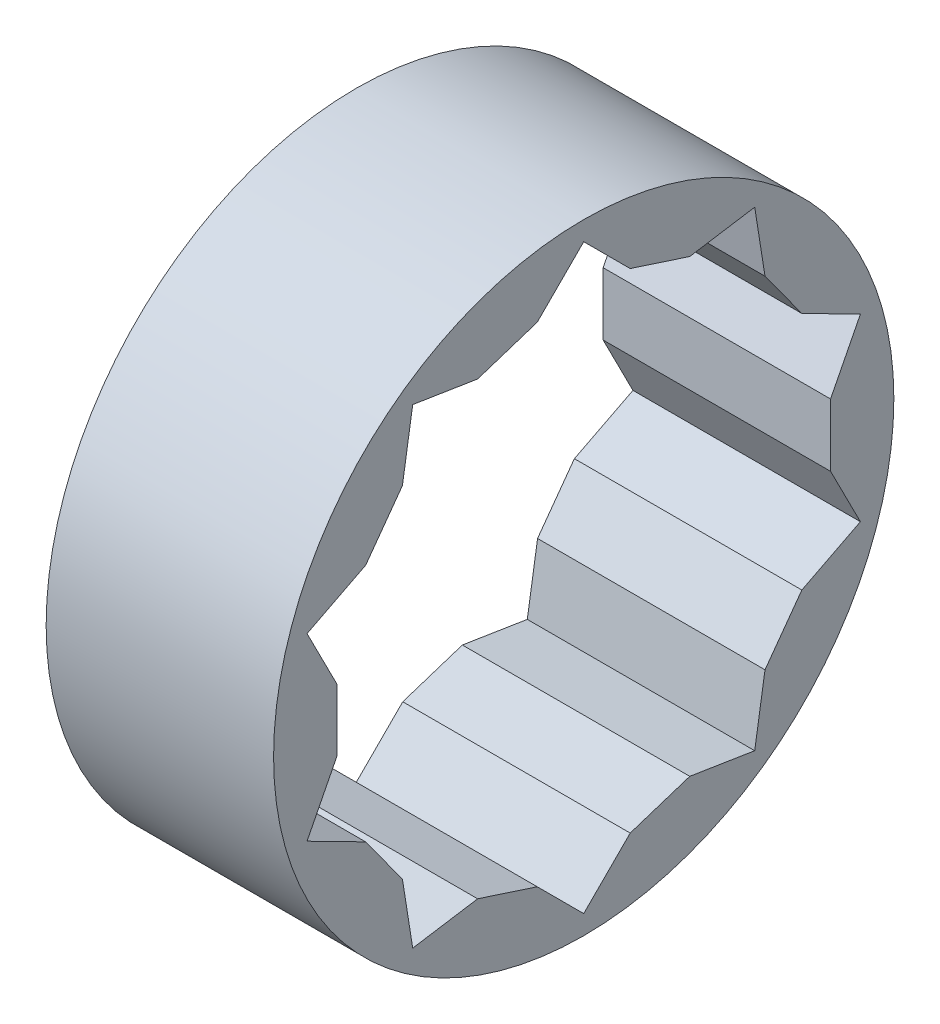
ISO-10303-21;
HEADER;
FILE_DESCRIPTION(('STEP AP214'),'2;1');
FILE_NAME('part.step','',(''),(''),'','','');
FILE_SCHEMA(('AUTOMOTIVE_DESIGN { 1 0 10303 214 1 1 1 1 }'));
ENDSEC;
DATA;
#1=APPLICATION_CONTEXT('core data for automotive mechanical design processes');
#2=APPLICATION_PROTOCOL_DEFINITION('international standard','automotive_design',2000,#1);
#3=PRODUCT_CONTEXT('',#1,'mechanical');
#4=PRODUCT('Part','Part','',(#3));
#5=PRODUCT_RELATED_PRODUCT_CATEGORY('part','',(#4));
#6=PRODUCT_DEFINITION_FORMATION('','',#4);
#7=PRODUCT_DEFINITION_CONTEXT('part definition',#1,'design');
#8=PRODUCT_DEFINITION('design','',#6,#7);
#9=PRODUCT_DEFINITION_SHAPE('','',#8);
#10=(LENGTH_UNIT() NAMED_UNIT(*) SI_UNIT(.MILLI.,.METRE.));
#11=(NAMED_UNIT(*) PLANE_ANGLE_UNIT() SI_UNIT($,.RADIAN.));
#12=(NAMED_UNIT(*) SI_UNIT($,.STERADIAN.) SOLID_ANGLE_UNIT());
#13=UNCERTAINTY_MEASURE_WITH_UNIT(LENGTH_MEASURE(1.E-05),#10,'distance_accuracy_value','');
#14=(GEOMETRIC_REPRESENTATION_CONTEXT(3) GLOBAL_UNCERTAINTY_ASSIGNED_CONTEXT((#13)) GLOBAL_UNIT_ASSIGNED_CONTEXT((#10,
#11,#12)) REPRESENTATION_CONTEXT('',''));
#15=CARTESIAN_POINT('',(0.,0.,0.));
#16=DIRECTION('',(0.,0.,1.));
#17=DIRECTION('',(1.,0.,0.));
#18=AXIS2_PLACEMENT_3D('',#15,#16,#17);
#19=CARTESIAN_POINT('',(22.,0.,0.));
#20=DIRECTION('',(1.,0.,0.));
#21=DIRECTION('',(0.,0.,-1.));
#22=AXIS2_PLACEMENT_3D('',#19,#20,#21);
#23=PLANE('',#22);
#24=CARTESIAN_POINT('',(22.,0.,0.));
#25=DIRECTION('',(1.,0.,0.));
#26=DIRECTION('',(0.,0.,-1.));
#27=AXIS2_PLACEMENT_3D('',#24,#25,#26);
#28=CIRCLE('',#27,30.);
#29=CARTESIAN_POINT('',(22.,0.,-30.));
#30=VERTEX_POINT('',#29);
#31=EDGE_CURVE('E11',#30,#30,#28,.T.);
#32=ORIENTED_EDGE('',*,*,#31,.T.);
#33=EDGE_LOOP('',(#32));
#34=FACE_BOUND('',#33,.T.);
#35=DIRECTION('',(0.,-0.809016994374925,0.587785252292504));
#36=VECTOR('',#35,1.);
#37=CARTESIAN_POINT('',(22.,11.5832247084016,21.0979328695125));
#38=LINE('',#37,#36);
#39=CARTESIAN_POINT('',(22.,16.4859132513626,17.5359211414864));
#40=VERTEX_POINT('',#39);
#41=CARTESIAN_POINT('',(22.,11.5832247084016,21.0979328695125));
#42=VERTEX_POINT('',#41);
#43=EDGE_CURVE('E249',#40,#42,#38,.T.);
#44=ORIENTED_EDGE('',*,*,#43,.F.);
#45=DIRECTION('',(0.,-0.987688340595256,0.156434465039482));
#46=VECTOR('',#45,1.);
#47=CARTESIAN_POINT('',(22.,16.4859132513626,17.5359211414864));
#48=LINE('',#47,#46);
#49=CARTESIAN_POINT('',(22.,22.7668881230699,16.5411124517435));
#50=VERTEX_POINT('',#49);
#51=EDGE_CURVE('E241',#50,#40,#48,.T.);
#52=ORIENTED_EDGE('',*,*,#51,.F.);
#53=DIRECTION('',(0.,0.156434465041359,0.987688340594959));
#54=VECTOR('',#53,1.);
#55=CARTESIAN_POINT('',(22.,22.7668881230699,16.5411124517435));
#56=LINE('',#55,#54);
#57=CARTESIAN_POINT('',(22.,21.7720794333149,10.2601375800374));
#58=VERTEX_POINT('',#57);
#59=EDGE_CURVE('E317',#58,#50,#56,.T.);
#60=ORIENTED_EDGE('',*,*,#59,.F.);
#61=DIRECTION('',(0.,-0.309016994374911,0.951056516295165));
#62=VECTOR('',#61,1.);
#63=CARTESIAN_POINT('',(22.,21.7720794333149,10.2601375800374));
#64=LINE('',#63,#62);
#65=CARTESIAN_POINT('',(22.,23.644739820471,4.49668153576589));
#66=VERTEX_POINT('',#65);
#67=EDGE_CURVE('E315',#66,#58,#64,.T.);
#68=ORIENTED_EDGE('',*,*,#67,.F.);
#69=DIRECTION('',(0.,-0.707106781186536,0.707106781186559));
#70=VECTOR('',#69,1.);
#71=CARTESIAN_POINT('',(22.,23.644739820471,4.49668153576589));
#72=LINE('',#71,#70);
#73=CARTESIAN_POINT('',(22.,28.1414213562373,-5.27369489224105E-13));
#74=VERTEX_POINT('',#73);
#75=EDGE_CURVE('E313',#74,#66,#72,.T.);
#76=ORIENTED_EDGE('',*,*,#75,.F.);
#77=DIRECTION('',(0.,0.707106781186562,0.707106781186533));
#78=VECTOR('',#77,1.);
#79=CARTESIAN_POINT('',(22.,28.1414213562373,-5.27369489224105E-13));
#80=LINE('',#79,#78);
#81=CARTESIAN_POINT('',(22.,23.6447398204709,-4.49668153576679));
#82=VERTEX_POINT('',#81);
#83=EDGE_CURVE('E311',#82,#74,#80,.T.);
#84=ORIENTED_EDGE('',*,*,#83,.F.);
#85=DIRECTION('',(0.,0.309016994375075,0.951056516295112));
#86=VECTOR('',#85,1.);
#87=CARTESIAN_POINT('',(22.,23.6447398204709,-4.49668153576679));
#88=LINE('',#87,#86);
#89=CARTESIAN_POINT('',(22.,21.7720794333138,-10.2601375800377));
#90=VERTEX_POINT('',#89);
#91=EDGE_CURVE('E309',#90,#82,#88,.T.);
#92=ORIENTED_EDGE('',*,*,#91,.F.);
#93=DIRECTION('',(0.,-0.156434465040067,0.987688340595164));
#94=VECTOR('',#93,1.);
#95=CARTESIAN_POINT('',(22.,21.7720794333138,-10.2601375800377));
#96=LINE('',#95,#94);
#97=CARTESIAN_POINT('',(22.,22.7668881230604,-16.5411124517443));
#98=VERTEX_POINT('',#97);
#99=EDGE_CURVE('E307',#98,#90,#96,.T.);
#100=ORIENTED_EDGE('',*,*,#99,.F.);
#101=DIRECTION('',(0.,0.987688340595167,0.156434465040044));
#102=VECTOR('',#101,1.);
#103=CARTESIAN_POINT('',(22.,22.7668881230604,-16.5411124517443));
#104=LINE('',#103,#102);
#105=CARTESIAN_POINT('',(22.,16.4859132513538,-17.5359211414908));
#106=VERTEX_POINT('',#105);
#107=EDGE_CURVE('E305',#106,#98,#104,.T.);
#108=ORIENTED_EDGE('',*,*,#107,.F.);
#109=DIRECTION('',(0.,0.809016994374948,0.587785252292473));
#110=VECTOR('',#109,1.);
#111=CARTESIAN_POINT('',(22.,16.4859132513538,-17.5359211414908));
#112=LINE('',#111,#110);
#113=CARTESIAN_POINT('',(22.,11.5832247083928,-21.0979328695166));
#114=VERTEX_POINT('',#113);
#115=EDGE_CURVE('E303',#114,#106,#112,.T.);
#116=ORIENTED_EDGE('',*,*,#115,.F.);
#117=DIRECTION('',(0.,0.45399049973967,0.891006524188305));
#118=VECTOR('',#117,1.);
#119=CARTESIAN_POINT('',(22.,11.5832247083928,-21.0979328695166));
#120=LINE('',#119,#118);
#121=CARTESIAN_POINT('',(22.,8.69617744494109,-26.7640821586548));
#122=VERTEX_POINT('',#121);
#123=EDGE_CURVE('E301',#122,#114,#120,.T.);
#124=ORIENTED_EDGE('',*,*,#123,.F.);
#125=DIRECTION('',(0.,0.891006524188297,-0.453990499739685));
#126=VECTOR('',#125,1.);
#127=CARTESIAN_POINT('',(22.,8.69617744494109,-26.7640821586548));
#128=LINE('',#127,#126);
#129=CARTESIAN_POINT('',(22.,3.03002815580295,-23.8770348952031));
#130=VERTEX_POINT('',#129);
#131=EDGE_CURVE('E299',#130,#122,#128,.T.);
#132=ORIENTED_EDGE('',*,*,#131,.F.);
#133=DIRECTION('',(0.,1.,0.));
#134=VECTOR('',#133,1.);
#135=CARTESIAN_POINT('',(22.,3.03002815580295,-23.8770348952031));
#136=LINE('',#135,#134);
#137=CARTESIAN_POINT('',(22.,-3.03002815580631,-23.8770348952031));
#138=VERTEX_POINT('',#137);
#139=EDGE_CURVE('E297',#138,#130,#136,.T.);
#140=ORIENTED_EDGE('',*,*,#139,.F.);
#141=DIRECTION('',(0.,0.891006524188205,0.453990499739867));
#142=VECTOR('',#141,1.);
#143=CARTESIAN_POINT('',(22.,-3.03002815580631,-23.8770348952031));
#144=LINE('',#143,#142);
#145=CARTESIAN_POINT('',(22.,-8.69617744494391,-26.764082158656));
#146=VERTEX_POINT('',#145);
#147=EDGE_CURVE('E295',#146,#138,#144,.T.);
#148=ORIENTED_EDGE('',*,*,#147,.F.);
#149=DIRECTION('',(0.,0.453990499739379,-0.891006524188453));
#150=VECTOR('',#149,1.);
#151=CARTESIAN_POINT('',(22.,-8.69617744494391,-26.764082158656));
#152=LINE('',#151,#150);
#153=CARTESIAN_POINT('',(22.,-11.5832247083938,-21.0979328695168));
#154=VERTEX_POINT('',#153);
#155=EDGE_CURVE('E293',#154,#146,#152,.T.);
#156=ORIENTED_EDGE('',*,*,#155,.F.);
#157=DIRECTION('',(0.,0.809016994374925,-0.587785252292505));
#158=VECTOR('',#157,1.);
#159=CARTESIAN_POINT('',(22.,-11.5832247083938,-21.0979328695168));
#160=LINE('',#159,#158);
#161=CARTESIAN_POINT('',(22.,-16.4859132513547,-17.5359211414908));
#162=VERTEX_POINT('',#161);
#163=EDGE_CURVE('E291',#162,#154,#160,.T.);
#164=ORIENTED_EDGE('',*,*,#163,.F.);
#165=DIRECTION('',(0.,0.987688340595138,-0.156434465040232));
#166=VECTOR('',#165,1.);
#167=CARTESIAN_POINT('',(22.,-16.4859132513547,-17.5359211414908));
#168=LINE('',#167,#166);
#169=CARTESIAN_POINT('',(22.,-22.7668881230611,-16.5411124517431));
#170=VERTEX_POINT('',#169);
#171=EDGE_CURVE('E289',#170,#162,#168,.T.);
#172=ORIENTED_EDGE('',*,*,#171,.F.);
#173=DIRECTION('',(0.,-0.156434465040297,-0.987688340595127));
#174=VECTOR('',#173,1.);
#175=CARTESIAN_POINT('',(22.,-22.7668881230611,-16.5411124517431));
#176=LINE('',#175,#174);
#177=CARTESIAN_POINT('',(22.,-21.7720794333129,-10.2601375800366));
#178=VERTEX_POINT('',#177);
#179=EDGE_CURVE('E287',#178,#170,#176,.T.);
#180=ORIENTED_EDGE('',*,*,#179,.F.);
#181=DIRECTION('',(0.,0.309016994374911,-0.951056516295165));
#182=VECTOR('',#181,1.);
#183=CARTESIAN_POINT('',(22.,-21.7720794333129,-10.2601375800366));
#184=LINE('',#183,#182);
#185=CARTESIAN_POINT('',(22.,-23.6447398204691,-4.49668153576512));
#186=VERTEX_POINT('',#185);
#187=EDGE_CURVE('E285',#186,#178,#184,.T.);
#188=ORIENTED_EDGE('',*,*,#187,.F.);
#189=DIRECTION('',(0.,0.70710678118654,-0.707106781186555));
#190=VECTOR('',#189,1.);
#191=CARTESIAN_POINT('',(22.,-23.6447398204691,-4.49668153576512));
#192=LINE('',#191,#190);
#193=CARTESIAN_POINT('',(22.,-28.1414213562355,1.42133483801987E-12));
#194=VERTEX_POINT('',#193);
#195=EDGE_CURVE('E283',#194,#186,#192,.T.);
#196=ORIENTED_EDGE('',*,*,#195,.F.);
#197=DIRECTION('',(0.,-0.70710678118661,-0.707106781186485));
#198=VECTOR('',#197,1.);
#199=CARTESIAN_POINT('',(22.,-28.1414213562355,1.42133483801987E-12));
#200=LINE('',#199,#198);
#201=CARTESIAN_POINT('',(22.,-23.6447398204688,4.4966815357674));
#202=VERTEX_POINT('',#201);
#203=EDGE_CURVE('E281',#202,#194,#200,.T.);
#204=ORIENTED_EDGE('',*,*,#203,.F.);
#205=DIRECTION('',(0.,-0.309016994375485,-0.951056516294979));
#206=VECTOR('',#205,1.);
#207=CARTESIAN_POINT('',(22.,-23.6447398204688,4.4966815357674));
#208=LINE('',#207,#206);
#209=CARTESIAN_POINT('',(22.,-21.7720794333089,10.2601375800383));
#210=VERTEX_POINT('',#209);
#211=EDGE_CURVE('E279',#210,#202,#208,.T.);
#212=ORIENTED_EDGE('',*,*,#211,.F.);
#213=DIRECTION('',(0.,0.156434465039923,-0.987688340595187));
#214=VECTOR('',#213,1.);
#215=CARTESIAN_POINT('',(22.,-21.7720794333089,10.2601375800383));
#216=LINE('',#215,#214);
#217=CARTESIAN_POINT('',(22.,-22.7668881230546,16.5411124517447));
#218=VERTEX_POINT('',#217);
#219=EDGE_CURVE('E277',#218,#210,#216,.T.);
#220=ORIENTED_EDGE('',*,*,#219,.F.);
#221=DIRECTION('',(0.,-0.987688340595206,-0.156434465039798));
#222=VECTOR('',#221,1.);
#223=CARTESIAN_POINT('',(22.,-22.7668881230546,16.5411124517447));
#224=LINE('',#223,#222);
#225=CARTESIAN_POINT('',(22.,-16.485913251348,17.5359211414897));
#226=VERTEX_POINT('',#225);
#227=EDGE_CURVE('E275',#226,#218,#224,.T.);
#228=ORIENTED_EDGE('',*,*,#227,.F.);
#229=DIRECTION('',(0.,-0.809016994374948,-0.587785252292472));
#230=VECTOR('',#229,1.);
#231=CARTESIAN_POINT('',(22.,-16.485913251348,17.5359211414897));
#232=LINE('',#231,#230);
#233=CARTESIAN_POINT('',(22.,-11.5832247083868,21.0979328695156));
#234=VERTEX_POINT('',#233);
#235=EDGE_CURVE('E273',#234,#226,#232,.T.);
#236=ORIENTED_EDGE('',*,*,#235,.F.);
#237=DIRECTION('',(0.,-0.453990499739754,-0.891006524188262));
#238=VECTOR('',#237,1.);
#239=CARTESIAN_POINT('',(22.,-11.5832247083868,21.0979328695156));
#240=LINE('',#239,#238);
#241=CARTESIAN_POINT('',(22.,-8.69617744493467,26.7640821586534));
#242=VERTEX_POINT('',#241);
#243=EDGE_CURVE('E271',#242,#234,#240,.T.);
#244=ORIENTED_EDGE('',*,*,#243,.F.);
#245=DIRECTION('',(0.,-0.891006524188261,0.453990499739757));
#246=VECTOR('',#245,1.);
#247=CARTESIAN_POINT('',(22.,-8.69617744493467,26.7640821586534));
#248=LINE('',#247,#246);
#249=CARTESIAN_POINT('',(22.,-3.03002815579684,23.8770348952013));
#250=VERTEX_POINT('',#249);
#251=EDGE_CURVE('E269',#250,#242,#248,.T.);
#252=ORIENTED_EDGE('',*,*,#251,.F.);
#253=DIRECTION('',(0.,-1.,0.));
#254=VECTOR('',#253,1.);
#255=CARTESIAN_POINT('',(22.,-3.03002815579684,23.8770348952013));
#256=LINE('',#255,#254);
#257=CARTESIAN_POINT('',(22.,3.0300281558126,23.8770348952013));
#258=VERTEX_POINT('',#257);
#259=EDGE_CURVE('E267',#258,#250,#256,.T.);
#260=ORIENTED_EDGE('',*,*,#259,.F.);
#261=DIRECTION('',(0.,-0.891006524188423,-0.453990499739439));
#262=VECTOR('',#261,1.);
#263=CARTESIAN_POINT('',(22.,3.0300281558126,23.8770348952013));
#264=LINE('',#263,#262);
#265=CARTESIAN_POINT('',(22.,8.69617744495146,26.7640821586514));
#266=VERTEX_POINT('',#265);
#267=EDGE_CURVE('E263',#266,#258,#264,.T.);
#268=ORIENTED_EDGE('',*,*,#267,.F.);
#269=DIRECTION('',(0.,-0.453990499739435,0.891006524188425));
#270=VECTOR('',#269,1.);
#271=CARTESIAN_POINT('',(22.,8.69617744495146,26.7640821586514));
#272=LINE('',#271,#270);
#273=EDGE_CURVE('E261',#42,#266,#272,.T.);
#274=ORIENTED_EDGE('',*,*,#273,.F.);
#275=EDGE_LOOP('',(#44,#52,#60,#68,#76,#84,#92,#100,#108,#116,#124,#132,#140,#148,#156,#164,
#172,#180,#188,#196,#204,#212,#220,#228,#236,#244,#252,#260,#268,#274));
#276=FACE_BOUND('',#275,.T.);
#277=ADVANCED_FACE('F44',(#34,#276),#23,.T.);
#278=CARTESIAN_POINT('',(0.,0.,0.));
#279=DIRECTION('',(1.,0.,0.));
#280=DIRECTION('',(0.,0.,-1.));
#281=AXIS2_PLACEMENT_3D('',#278,#279,#280);
#282=PLANE('',#281);
#283=CARTESIAN_POINT('',(0.,0.,0.));
#284=DIRECTION('',(1.,0.,0.));
#285=DIRECTION('',(0.,0.,-1.));
#286=AXIS2_PLACEMENT_3D('',#283,#284,#285);
#287=CIRCLE('',#286,30.);
#288=CARTESIAN_POINT('',(0.,0.,-30.));
#289=VERTEX_POINT('',#288);
#290=EDGE_CURVE('E48',#289,#289,#287,.T.);
#291=ORIENTED_EDGE('',*,*,#290,.F.);
#292=EDGE_LOOP('',(#291));
#293=FACE_BOUND('',#292,.T.);
#294=DIRECTION('',(0.,-0.987688340595256,0.156434465039482));
#295=VECTOR('',#294,1.);
#296=CARTESIAN_POINT('',(0.,16.4859132513626,17.5359211414864));
#297=LINE('',#296,#295);
#298=CARTESIAN_POINT('',(0.,22.7668881230699,16.5411124517435));
#299=VERTEX_POINT('',#298);
#300=CARTESIAN_POINT('',(0.,16.4859132513626,17.5359211414864));
#301=VERTEX_POINT('',#300);
#302=EDGE_CURVE('E67',#299,#301,#297,.T.);
#303=ORIENTED_EDGE('',*,*,#302,.T.);
#304=DIRECTION('',(0.,-0.809016994374925,0.587785252292504));
#305=VECTOR('',#304,1.);
#306=CARTESIAN_POINT('',(0.,11.5832247084016,21.0979328695125));
#307=LINE('',#306,#305);
#308=CARTESIAN_POINT('',(0.,11.5832247084016,21.0979328695125));
#309=VERTEX_POINT('',#308);
#310=EDGE_CURVE('E256',#301,#309,#307,.T.);
#311=ORIENTED_EDGE('',*,*,#310,.T.);
#312=DIRECTION('',(0.,-0.453990499739435,0.891006524188425));
#313=VECTOR('',#312,1.);
#314=CARTESIAN_POINT('',(0.,8.69617744495146,26.7640821586514));
#315=LINE('',#314,#313);
#316=CARTESIAN_POINT('',(0.,8.69617744495146,26.7640821586514));
#317=VERTEX_POINT('',#316);
#318=EDGE_CURVE('E321',#309,#317,#315,.T.);
#319=ORIENTED_EDGE('',*,*,#318,.T.);
#320=DIRECTION('',(0.,-0.891006524188423,-0.453990499739439));
#321=VECTOR('',#320,1.);
#322=CARTESIAN_POINT('',(0.,3.0300281558126,23.8770348952013));
#323=LINE('',#322,#321);
#324=CARTESIAN_POINT('',(0.,3.0300281558126,23.8770348952013));
#325=VERTEX_POINT('',#324);
#326=EDGE_CURVE('E324',#317,#325,#323,.T.);
#327=ORIENTED_EDGE('',*,*,#326,.T.);
#328=DIRECTION('',(0.,-1.,0.));
#329=VECTOR('',#328,1.);
#330=CARTESIAN_POINT('',(0.,-3.03002815579684,23.8770348952013));
#331=LINE('',#330,#329);
#332=CARTESIAN_POINT('',(0.,-3.03002815579684,23.8770348952013));
#333=VERTEX_POINT('',#332);
#334=EDGE_CURVE('E327',#325,#333,#331,.T.);
#335=ORIENTED_EDGE('',*,*,#334,.T.);
#336=DIRECTION('',(0.,-0.891006524188261,0.453990499739757));
#337=VECTOR('',#336,1.);
#338=CARTESIAN_POINT('',(0.,-8.69617744493467,26.7640821586534));
#339=LINE('',#338,#337);
#340=CARTESIAN_POINT('',(0.,-8.69617744493467,26.7640821586534));
#341=VERTEX_POINT('',#340);
#342=EDGE_CURVE('E330',#333,#341,#339,.T.);
#343=ORIENTED_EDGE('',*,*,#342,.T.);
#344=DIRECTION('',(0.,-0.453990499739754,-0.891006524188262));
#345=VECTOR('',#344,1.);
#346=CARTESIAN_POINT('',(0.,-11.5832247083868,21.0979328695156));
#347=LINE('',#346,#345);
#348=CARTESIAN_POINT('',(0.,-11.5832247083868,21.0979328695156));
#349=VERTEX_POINT('',#348);
#350=EDGE_CURVE('E333',#341,#349,#347,.T.);
#351=ORIENTED_EDGE('',*,*,#350,.T.);
#352=DIRECTION('',(0.,-0.809016994374948,-0.587785252292472));
#353=VECTOR('',#352,1.);
#354=CARTESIAN_POINT('',(0.,-16.485913251348,17.5359211414897));
#355=LINE('',#354,#353);
#356=CARTESIAN_POINT('',(0.,-16.485913251348,17.5359211414897));
#357=VERTEX_POINT('',#356);
#358=EDGE_CURVE('E336',#349,#357,#355,.T.);
#359=ORIENTED_EDGE('',*,*,#358,.T.);
#360=DIRECTION('',(0.,-0.987688340595206,-0.156434465039798));
#361=VECTOR('',#360,1.);
#362=CARTESIAN_POINT('',(0.,-22.7668881230546,16.5411124517447));
#363=LINE('',#362,#361);
#364=CARTESIAN_POINT('',(0.,-22.7668881230546,16.5411124517447));
#365=VERTEX_POINT('',#364);
#366=EDGE_CURVE('E339',#357,#365,#363,.T.);
#367=ORIENTED_EDGE('',*,*,#366,.T.);
#368=DIRECTION('',(0.,0.156434465039923,-0.987688340595187));
#369=VECTOR('',#368,1.);
#370=CARTESIAN_POINT('',(0.,-21.7720794333089,10.2601375800383));
#371=LINE('',#370,#369);
#372=CARTESIAN_POINT('',(0.,-21.7720794333089,10.2601375800383));
#373=VERTEX_POINT('',#372);
#374=EDGE_CURVE('E342',#365,#373,#371,.T.);
#375=ORIENTED_EDGE('',*,*,#374,.T.);
#376=DIRECTION('',(0.,-0.309016994375485,-0.951056516294979));
#377=VECTOR('',#376,1.);
#378=CARTESIAN_POINT('',(0.,-23.6447398204688,4.4966815357674));
#379=LINE('',#378,#377);
#380=CARTESIAN_POINT('',(0.,-23.6447398204688,4.4966815357674));
#381=VERTEX_POINT('',#380);
#382=EDGE_CURVE('E345',#373,#381,#379,.T.);
#383=ORIENTED_EDGE('',*,*,#382,.T.);
#384=DIRECTION('',(0.,-0.70710678118661,-0.707106781186485));
#385=VECTOR('',#384,1.);
#386=CARTESIAN_POINT('',(0.,-28.1414213562355,1.42133483801987E-12));
#387=LINE('',#386,#385);
#388=CARTESIAN_POINT('',(0.,-28.1414213562355,1.42133483801987E-12));
#389=VERTEX_POINT('',#388);
#390=EDGE_CURVE('E348',#381,#389,#387,.T.);
#391=ORIENTED_EDGE('',*,*,#390,.T.);
#392=DIRECTION('',(0.,0.70710678118654,-0.707106781186555));
#393=VECTOR('',#392,1.);
#394=CARTESIAN_POINT('',(0.,-23.6447398204691,-4.49668153576512));
#395=LINE('',#394,#393);
#396=CARTESIAN_POINT('',(0.,-23.6447398204691,-4.49668153576512));
#397=VERTEX_POINT('',#396);
#398=EDGE_CURVE('E351',#389,#397,#395,.T.);
#399=ORIENTED_EDGE('',*,*,#398,.T.);
#400=DIRECTION('',(0.,0.309016994374911,-0.951056516295165));
#401=VECTOR('',#400,1.);
#402=CARTESIAN_POINT('',(0.,-21.7720794333129,-10.2601375800366));
#403=LINE('',#402,#401);
#404=CARTESIAN_POINT('',(0.,-21.7720794333129,-10.2601375800366));
#405=VERTEX_POINT('',#404);
#406=EDGE_CURVE('E354',#397,#405,#403,.T.);
#407=ORIENTED_EDGE('',*,*,#406,.T.);
#408=DIRECTION('',(0.,-0.156434465040297,-0.987688340595127));
#409=VECTOR('',#408,1.);
#410=CARTESIAN_POINT('',(0.,-22.7668881230611,-16.5411124517431));
#411=LINE('',#410,#409);
#412=CARTESIAN_POINT('',(0.,-22.7668881230611,-16.5411124517431));
#413=VERTEX_POINT('',#412);
#414=EDGE_CURVE('E357',#405,#413,#411,.T.);
#415=ORIENTED_EDGE('',*,*,#414,.T.);
#416=DIRECTION('',(0.,0.987688340595138,-0.156434465040232));
#417=VECTOR('',#416,1.);
#418=CARTESIAN_POINT('',(0.,-16.4859132513547,-17.5359211414908));
#419=LINE('',#418,#417);
#420=CARTESIAN_POINT('',(0.,-16.4859132513547,-17.5359211414908));
#421=VERTEX_POINT('',#420);
#422=EDGE_CURVE('E360',#413,#421,#419,.T.);
#423=ORIENTED_EDGE('',*,*,#422,.T.);
#424=DIRECTION('',(0.,0.809016994374925,-0.587785252292505));
#425=VECTOR('',#424,1.);
#426=CARTESIAN_POINT('',(0.,-11.5832247083938,-21.0979328695168));
#427=LINE('',#426,#425);
#428=CARTESIAN_POINT('',(0.,-11.5832247083938,-21.0979328695168));
#429=VERTEX_POINT('',#428);
#430=EDGE_CURVE('E363',#421,#429,#427,.T.);
#431=ORIENTED_EDGE('',*,*,#430,.T.);
#432=DIRECTION('',(0.,0.453990499739379,-0.891006524188453));
#433=VECTOR('',#432,1.);
#434=CARTESIAN_POINT('',(0.,-8.69617744494391,-26.764082158656));
#435=LINE('',#434,#433);
#436=CARTESIAN_POINT('',(0.,-8.69617744494391,-26.764082158656));
#437=VERTEX_POINT('',#436);
#438=EDGE_CURVE('E366',#429,#437,#435,.T.);
#439=ORIENTED_EDGE('',*,*,#438,.T.);
#440=DIRECTION('',(0.,0.891006524188205,0.453990499739867));
#441=VECTOR('',#440,1.);
#442=CARTESIAN_POINT('',(0.,-3.03002815580631,-23.8770348952031));
#443=LINE('',#442,#441);
#444=CARTESIAN_POINT('',(0.,-3.03002815580631,-23.8770348952031));
#445=VERTEX_POINT('',#444);
#446=EDGE_CURVE('E369',#437,#445,#443,.T.);
#447=ORIENTED_EDGE('',*,*,#446,.T.);
#448=DIRECTION('',(0.,1.,0.));
#449=VECTOR('',#448,1.);
#450=CARTESIAN_POINT('',(0.,3.03002815580295,-23.8770348952031));
#451=LINE('',#450,#449);
#452=CARTESIAN_POINT('',(0.,3.03002815580295,-23.8770348952031));
#453=VERTEX_POINT('',#452);
#454=EDGE_CURVE('E372',#445,#453,#451,.T.);
#455=ORIENTED_EDGE('',*,*,#454,.T.);
#456=DIRECTION('',(0.,0.891006524188297,-0.453990499739685));
#457=VECTOR('',#456,1.);
#458=CARTESIAN_POINT('',(0.,8.69617744494109,-26.7640821586548));
#459=LINE('',#458,#457);
#460=CARTESIAN_POINT('',(0.,8.69617744494109,-26.7640821586548));
#461=VERTEX_POINT('',#460);
#462=EDGE_CURVE('E375',#453,#461,#459,.T.);
#463=ORIENTED_EDGE('',*,*,#462,.T.);
#464=DIRECTION('',(0.,0.45399049973967,0.891006524188305));
#465=VECTOR('',#464,1.);
#466=CARTESIAN_POINT('',(0.,11.5832247083928,-21.0979328695166));
#467=LINE('',#466,#465);
#468=CARTESIAN_POINT('',(0.,11.5832247083928,-21.0979328695166));
#469=VERTEX_POINT('',#468);
#470=EDGE_CURVE('E378',#461,#469,#467,.T.);
#471=ORIENTED_EDGE('',*,*,#470,.T.);
#472=DIRECTION('',(0.,0.809016994374948,0.587785252292473));
#473=VECTOR('',#472,1.);
#474=CARTESIAN_POINT('',(0.,16.4859132513538,-17.5359211414908));
#475=LINE('',#474,#473);
#476=CARTESIAN_POINT('',(0.,16.4859132513538,-17.5359211414908));
#477=VERTEX_POINT('',#476);
#478=EDGE_CURVE('E381',#469,#477,#475,.T.);
#479=ORIENTED_EDGE('',*,*,#478,.T.);
#480=DIRECTION('',(0.,0.987688340595167,0.156434465040044));
#481=VECTOR('',#480,1.);
#482=CARTESIAN_POINT('',(0.,22.7668881230604,-16.5411124517443));
#483=LINE('',#482,#481);
#484=CARTESIAN_POINT('',(0.,22.7668881230604,-16.5411124517443));
#485=VERTEX_POINT('',#484);
#486=EDGE_CURVE('E384',#477,#485,#483,.T.);
#487=ORIENTED_EDGE('',*,*,#486,.T.);
#488=DIRECTION('',(0.,-0.156434465040067,0.987688340595164));
#489=VECTOR('',#488,1.);
#490=CARTESIAN_POINT('',(0.,21.7720794333138,-10.2601375800377));
#491=LINE('',#490,#489);
#492=CARTESIAN_POINT('',(0.,21.7720794333138,-10.2601375800377));
#493=VERTEX_POINT('',#492);
#494=EDGE_CURVE('E387',#485,#493,#491,.T.);
#495=ORIENTED_EDGE('',*,*,#494,.T.);
#496=DIRECTION('',(0.,0.309016994375075,0.951056516295112));
#497=VECTOR('',#496,1.);
#498=CARTESIAN_POINT('',(0.,23.6447398204709,-4.49668153576679));
#499=LINE('',#498,#497);
#500=CARTESIAN_POINT('',(0.,23.6447398204709,-4.49668153576679));
#501=VERTEX_POINT('',#500);
#502=EDGE_CURVE('E390',#493,#501,#499,.T.);
#503=ORIENTED_EDGE('',*,*,#502,.T.);
#504=DIRECTION('',(0.,0.707106781186562,0.707106781186533));
#505=VECTOR('',#504,1.);
#506=CARTESIAN_POINT('',(0.,28.1414213562373,-5.27369489224105E-13));
#507=LINE('',#506,#505);
#508=CARTESIAN_POINT('',(0.,28.1414213562373,-5.27369489224105E-13));
#509=VERTEX_POINT('',#508);
#510=EDGE_CURVE('E393',#501,#509,#507,.T.);
#511=ORIENTED_EDGE('',*,*,#510,.T.);
#512=DIRECTION('',(0.,-0.707106781186536,0.707106781186559));
#513=VECTOR('',#512,1.);
#514=CARTESIAN_POINT('',(0.,23.644739820471,4.49668153576589));
#515=LINE('',#514,#513);
#516=CARTESIAN_POINT('',(0.,23.644739820471,4.49668153576589));
#517=VERTEX_POINT('',#516);
#518=EDGE_CURVE('E396',#509,#517,#515,.T.);
#519=ORIENTED_EDGE('',*,*,#518,.T.);
#520=DIRECTION('',(0.,-0.309016994374911,0.951056516295165));
#521=VECTOR('',#520,1.);
#522=CARTESIAN_POINT('',(0.,21.7720794333149,10.2601375800374));
#523=LINE('',#522,#521);
#524=CARTESIAN_POINT('',(0.,21.7720794333149,10.2601375800374));
#525=VERTEX_POINT('',#524);
#526=EDGE_CURVE('E399',#517,#525,#523,.T.);
#527=ORIENTED_EDGE('',*,*,#526,.T.);
#528=DIRECTION('',(0.,0.156434465041359,0.987688340594959));
#529=VECTOR('',#528,1.);
#530=CARTESIAN_POINT('',(0.,22.7668881230699,16.5411124517435));
#531=LINE('',#530,#529);
#532=EDGE_CURVE('E250',#525,#299,#531,.T.);
#533=ORIENTED_EDGE('',*,*,#532,.T.);
#534=EDGE_LOOP('',(#303,#311,#319,#327,#335,#343,#351,#359,#367,#375,#383,#391,#399,#407,#415,
#423,#431,#439,#447,#455,#463,#471,#479,#487,#495,#503,#511,#519,#527,#533));
#535=FACE_BOUND('',#534,.T.);
#536=ADVANCED_FACE('F464',(#293,#535),#282,.F.);
#537=CARTESIAN_POINT('',(22.,0.,0.));
#538=DIRECTION('',(-1.,0.,0.));
#539=DIRECTION('',(0.,0.,1.));
#540=AXIS2_PLACEMENT_3D('',#537,#538,#539);
#541=CYLINDRICAL_SURFACE('',#540,30.);
#542=ORIENTED_EDGE('',*,*,#31,.F.);
#543=EDGE_LOOP('',(#542));
#544=FACE_BOUND('',#543,.T.);
#545=ORIENTED_EDGE('',*,*,#290,.T.);
#546=EDGE_LOOP('',(#545));
#547=FACE_BOUND('',#546,.T.);
#548=ADVANCED_FACE('F46',(#544,#547),#541,.T.);
#549=CARTESIAN_POINT('',(22.,16.4859132513626,17.5359211414864));
#550=DIRECTION('',(0.,-0.156434465039482,-0.987688340595256));
#551=DIRECTION('',(0.,0.987688340595256,-0.156434465039482));
#552=AXIS2_PLACEMENT_3D('',#549,#550,#551);
#553=PLANE('',#552);
#554=ORIENTED_EDGE('',*,*,#302,.F.);
#555=DIRECTION('',(-1.,0.,0.));
#556=VECTOR('',#555,1.);
#557=CARTESIAN_POINT('',(22.,22.7668881230699,16.5411124517435));
#558=LINE('',#557,#556);
#559=EDGE_CURVE('E245',#50,#299,#558,.T.);
#560=ORIENTED_EDGE('',*,*,#559,.F.);
#561=ORIENTED_EDGE('',*,*,#51,.T.);
#562=DIRECTION('',(-1.,0.,0.));
#563=VECTOR('',#562,1.);
#564=CARTESIAN_POINT('',(22.,16.4859132513626,17.5359211414864));
#565=LINE('',#564,#563);
#566=EDGE_CURVE('E244',#40,#301,#565,.T.);
#567=ORIENTED_EDGE('',*,*,#566,.T.);
#568=EDGE_LOOP('',(#554,#560,#561,#567));
#569=FACE_BOUND('',#568,.T.);
#570=ADVANCED_FACE('F243',(#569),#553,.T.);
#571=CARTESIAN_POINT('',(22.,11.5832247084016,21.0979328695125));
#572=DIRECTION('',(0.,-0.587785252292505,-0.809016994374925));
#573=DIRECTION('',(0.,0.809016994374925,-0.587785252292505));
#574=AXIS2_PLACEMENT_3D('',#571,#572,#573);
#575=PLANE('',#574);
#576=ORIENTED_EDGE('',*,*,#310,.F.);
#577=ORIENTED_EDGE('',*,*,#566,.F.);
#578=ORIENTED_EDGE('',*,*,#43,.T.);
#579=DIRECTION('',(-1.,0.,0.));
#580=VECTOR('',#579,1.);
#581=CARTESIAN_POINT('',(22.,11.5832247084016,21.0979328695125));
#582=LINE('',#581,#580);
#583=EDGE_CURVE('E257',#42,#309,#582,.T.);
#584=ORIENTED_EDGE('',*,*,#583,.T.);
#585=EDGE_LOOP('',(#576,#577,#578,#584));
#586=FACE_BOUND('',#585,.T.);
#587=ADVANCED_FACE('F253',(#586),#575,.T.);
#588=CARTESIAN_POINT('',(22.,8.69617744495146,26.7640821586514));
#589=DIRECTION('',(0.,-0.891006524188425,-0.453990499739435));
#590=DIRECTION('',(0.,0.453990499739435,-0.891006524188425));
#591=AXIS2_PLACEMENT_3D('',#588,#589,#590);
#592=PLANE('',#591);
#593=ORIENTED_EDGE('',*,*,#318,.F.);
#594=ORIENTED_EDGE('',*,*,#583,.F.);
#595=ORIENTED_EDGE('',*,*,#273,.T.);
#596=DIRECTION('',(-1.,0.,0.));
#597=VECTOR('',#596,1.);
#598=CARTESIAN_POINT('',(22.,8.69617744495146,26.7640821586514));
#599=LINE('',#598,#597);
#600=EDGE_CURVE('E456',#266,#317,#599,.T.);
#601=ORIENTED_EDGE('',*,*,#600,.T.);
#602=EDGE_LOOP('',(#593,#594,#595,#601));
#603=FACE_BOUND('',#602,.T.);
#604=ADVANCED_FACE('F460',(#603),#592,.T.);
#605=CARTESIAN_POINT('',(22.,3.0300281558126,23.8770348952013));
#606=DIRECTION('',(0.,0.453990499739439,-0.891006524188423));
#607=DIRECTION('',(0.,0.891006524188423,0.453990499739439));
#608=AXIS2_PLACEMENT_3D('',#605,#606,#607);
#609=PLANE('',#608);
#610=ORIENTED_EDGE('',*,*,#326,.F.);
#611=ORIENTED_EDGE('',*,*,#600,.F.);
#612=ORIENTED_EDGE('',*,*,#267,.T.);
#613=DIRECTION('',(-1.,0.,0.));
#614=VECTOR('',#613,1.);
#615=CARTESIAN_POINT('',(22.,3.0300281558126,23.8770348952013));
#616=LINE('',#615,#614);
#617=EDGE_CURVE('E454',#258,#325,#616,.T.);
#618=ORIENTED_EDGE('',*,*,#617,.T.);
#619=EDGE_LOOP('',(#610,#611,#612,#618));
#620=FACE_BOUND('',#619,.T.);
#621=ADVANCED_FACE('F592',(#620),#609,.T.);
#622=CARTESIAN_POINT('',(22.,-3.03002815579684,23.8770348952013));
#623=DIRECTION('',(0.,0.,-1.));
#624=DIRECTION('',(-1.,0.,0.));
#625=AXIS2_PLACEMENT_3D('',#622,#623,#624);
#626=PLANE('',#625);
#627=ORIENTED_EDGE('',*,*,#334,.F.);
#628=ORIENTED_EDGE('',*,*,#617,.F.);
#629=ORIENTED_EDGE('',*,*,#259,.T.);
#630=DIRECTION('',(-1.,0.,0.));
#631=VECTOR('',#630,1.);
#632=CARTESIAN_POINT('',(22.,-3.03002815579684,23.8770348952013));
#633=LINE('',#632,#631);
#634=EDGE_CURVE('E452',#250,#333,#633,.T.);
#635=ORIENTED_EDGE('',*,*,#634,.T.);
#636=EDGE_LOOP('',(#627,#628,#629,#635));
#637=FACE_BOUND('',#636,.T.);
#638=ADVANCED_FACE('F590',(#637),#626,.T.);
#639=CARTESIAN_POINT('',(22.,-8.69617744493467,26.7640821586534));
#640=DIRECTION('',(0.,-0.453990499739757,-0.891006524188261));
#641=DIRECTION('',(0.,0.891006524188261,-0.453990499739757));
#642=AXIS2_PLACEMENT_3D('',#639,#640,#641);
#643=PLANE('',#642);
#644=ORIENTED_EDGE('',*,*,#342,.F.);
#645=ORIENTED_EDGE('',*,*,#634,.F.);
#646=ORIENTED_EDGE('',*,*,#251,.T.);
#647=DIRECTION('',(-1.,0.,0.));
#648=VECTOR('',#647,1.);
#649=CARTESIAN_POINT('',(22.,-8.69617744493467,26.7640821586534));
#650=LINE('',#649,#648);
#651=EDGE_CURVE('E450',#242,#341,#650,.T.);
#652=ORIENTED_EDGE('',*,*,#651,.T.);
#653=EDGE_LOOP('',(#644,#645,#646,#652));
#654=FACE_BOUND('',#653,.T.);
#655=ADVANCED_FACE('F584',(#654),#643,.T.);
#656=CARTESIAN_POINT('',(22.,-11.5832247083868,21.0979328695156));
#657=DIRECTION('',(0.,0.891006524188262,-0.453990499739754));
#658=DIRECTION('',(0.,0.453990499739754,0.891006524188262));
#659=AXIS2_PLACEMENT_3D('',#656,#657,#658);
#660=PLANE('',#659);
#661=ORIENTED_EDGE('',*,*,#350,.F.);
#662=ORIENTED_EDGE('',*,*,#651,.F.);
#663=ORIENTED_EDGE('',*,*,#243,.T.);
#664=DIRECTION('',(-1.,0.,0.));
#665=VECTOR('',#664,1.);
#666=CARTESIAN_POINT('',(22.,-11.5832247083868,21.0979328695156));
#667=LINE('',#666,#665);
#668=EDGE_CURVE('E448',#234,#349,#667,.T.);
#669=ORIENTED_EDGE('',*,*,#668,.T.);
#670=EDGE_LOOP('',(#661,#662,#663,#669));
#671=FACE_BOUND('',#670,.T.);
#672=ADVANCED_FACE('F580',(#671),#660,.T.);
#673=CARTESIAN_POINT('',(22.,-16.485913251348,17.5359211414897));
#674=DIRECTION('',(0.,0.587785252292472,-0.809016994374948));
#675=DIRECTION('',(0.,0.809016994374948,0.587785252292472));
#676=AXIS2_PLACEMENT_3D('',#673,#674,#675);
#677=PLANE('',#676);
#678=ORIENTED_EDGE('',*,*,#358,.F.);
#679=ORIENTED_EDGE('',*,*,#668,.F.);
#680=ORIENTED_EDGE('',*,*,#235,.T.);
#681=DIRECTION('',(-1.,0.,0.));
#682=VECTOR('',#681,1.);
#683=CARTESIAN_POINT('',(22.,-16.485913251348,17.5359211414897));
#684=LINE('',#683,#682);
#685=EDGE_CURVE('E446',#226,#357,#684,.T.);
#686=ORIENTED_EDGE('',*,*,#685,.T.);
#687=EDGE_LOOP('',(#678,#679,#680,#686));
#688=FACE_BOUND('',#687,.T.);
#689=ADVANCED_FACE('F577',(#688),#677,.T.);
#690=CARTESIAN_POINT('',(22.,-22.7668881230546,16.5411124517447));
#691=DIRECTION('',(0.,0.156434465039798,-0.987688340595206));
#692=DIRECTION('',(0.,0.987688340595206,0.156434465039798));
#693=AXIS2_PLACEMENT_3D('',#690,#691,#692);
#694=PLANE('',#693);
#695=ORIENTED_EDGE('',*,*,#366,.F.);
#696=ORIENTED_EDGE('',*,*,#685,.F.);
#697=ORIENTED_EDGE('',*,*,#227,.T.);
#698=DIRECTION('',(-1.,0.,0.));
#699=VECTOR('',#698,1.);
#700=CARTESIAN_POINT('',(22.,-22.7668881230546,16.5411124517447));
#701=LINE('',#700,#699);
#702=EDGE_CURVE('E444',#218,#365,#701,.T.);
#703=ORIENTED_EDGE('',*,*,#702,.T.);
#704=EDGE_LOOP('',(#695,#696,#697,#703));
#705=FACE_BOUND('',#704,.T.);
#706=ADVANCED_FACE('F569',(#705),#694,.T.);
#707=CARTESIAN_POINT('',(22.,-21.7720794333089,10.2601375800383));
#708=DIRECTION('',(0.,0.987688340595187,0.156434465039923));
#709=DIRECTION('',(0.,-0.156434465039923,0.987688340595187));
#710=AXIS2_PLACEMENT_3D('',#707,#708,#709);
#711=PLANE('',#710);
#712=ORIENTED_EDGE('',*,*,#374,.F.);
#713=ORIENTED_EDGE('',*,*,#702,.F.);
#714=ORIENTED_EDGE('',*,*,#219,.T.);
#715=DIRECTION('',(-1.,0.,0.));
#716=VECTOR('',#715,1.);
#717=CARTESIAN_POINT('',(22.,-21.7720794333089,10.2601375800383));
#718=LINE('',#717,#716);
#719=EDGE_CURVE('E442',#210,#373,#718,.T.);
#720=ORIENTED_EDGE('',*,*,#719,.T.);
#721=EDGE_LOOP('',(#712,#713,#714,#720));
#722=FACE_BOUND('',#721,.T.);
#723=ADVANCED_FACE('F565',(#722),#711,.T.);
#724=CARTESIAN_POINT('',(22.,-23.6447398204688,4.4966815357674));
#725=DIRECTION('',(0.,0.951056516294979,-0.309016994375485));
#726=DIRECTION('',(0.,0.309016994375485,0.951056516294979));
#727=AXIS2_PLACEMENT_3D('',#724,#725,#726);
#728=PLANE('',#727);
#729=ORIENTED_EDGE('',*,*,#382,.F.);
#730=ORIENTED_EDGE('',*,*,#719,.F.);
#731=ORIENTED_EDGE('',*,*,#211,.T.);
#732=DIRECTION('',(-1.,0.,0.));
#733=VECTOR('',#732,1.);
#734=CARTESIAN_POINT('',(22.,-23.6447398204688,4.4966815357674));
#735=LINE('',#734,#733);
#736=EDGE_CURVE('E440',#202,#381,#735,.T.);
#737=ORIENTED_EDGE('',*,*,#736,.T.);
#738=EDGE_LOOP('',(#729,#730,#731,#737));
#739=FACE_BOUND('',#738,.T.);
#740=ADVANCED_FACE('F562',(#739),#728,.T.);
#741=CARTESIAN_POINT('',(22.,-28.1414213562355,1.42133483801987E-12));
#742=DIRECTION('',(0.,0.707106781186485,-0.70710678118661));
#743=DIRECTION('',(0.,0.70710678118661,0.707106781186485));
#744=AXIS2_PLACEMENT_3D('',#741,#742,#743);
#745=PLANE('',#744);
#746=ORIENTED_EDGE('',*,*,#390,.F.);
#747=ORIENTED_EDGE('',*,*,#736,.F.);
#748=ORIENTED_EDGE('',*,*,#203,.T.);
#749=DIRECTION('',(-1.,0.,0.));
#750=VECTOR('',#749,1.);
#751=CARTESIAN_POINT('',(22.,-28.1414213562355,1.42133483801987E-12));
#752=LINE('',#751,#750);
#753=EDGE_CURVE('E438',#194,#389,#752,.T.);
#754=ORIENTED_EDGE('',*,*,#753,.T.);
#755=EDGE_LOOP('',(#746,#747,#748,#754));
#756=FACE_BOUND('',#755,.T.);
#757=ADVANCED_FACE('F554',(#756),#745,.T.);
#758=CARTESIAN_POINT('',(22.,-23.6447398204691,-4.49668153576512));
#759=DIRECTION('',(0.,0.707106781186555,0.70710678118654));
#760=DIRECTION('',(0.,-0.70710678118654,0.707106781186555));
#761=AXIS2_PLACEMENT_3D('',#758,#759,#760);
#762=PLANE('',#761);
#763=ORIENTED_EDGE('',*,*,#398,.F.);
#764=ORIENTED_EDGE('',*,*,#753,.F.);
#765=ORIENTED_EDGE('',*,*,#195,.T.);
#766=DIRECTION('',(-1.,0.,0.));
#767=VECTOR('',#766,1.);
#768=CARTESIAN_POINT('',(22.,-23.6447398204691,-4.49668153576512));
#769=LINE('',#768,#767);
#770=EDGE_CURVE('E436',#186,#397,#769,.T.);
#771=ORIENTED_EDGE('',*,*,#770,.T.);
#772=EDGE_LOOP('',(#763,#764,#765,#771));
#773=FACE_BOUND('',#772,.T.);
#774=ADVANCED_FACE('F550',(#773),#762,.T.);
#775=CARTESIAN_POINT('',(22.,-21.7720794333129,-10.2601375800366));
#776=DIRECTION('',(0.,0.951056516295166,0.309016994374911));
#777=DIRECTION('',(0.,-0.309016994374911,0.951056516295165));
#778=AXIS2_PLACEMENT_3D('',#775,#776,#777);
#779=PLANE('',#778);
#780=ORIENTED_EDGE('',*,*,#406,.F.);
#781=ORIENTED_EDGE('',*,*,#770,.F.);
#782=ORIENTED_EDGE('',*,*,#187,.T.);
#783=DIRECTION('',(-1.,0.,0.));
#784=VECTOR('',#783,1.);
#785=CARTESIAN_POINT('',(22.,-21.7720794333129,-10.2601375800366));
#786=LINE('',#785,#784);
#787=EDGE_CURVE('E434',#178,#405,#786,.T.);
#788=ORIENTED_EDGE('',*,*,#787,.T.);
#789=EDGE_LOOP('',(#780,#781,#782,#788));
#790=FACE_BOUND('',#789,.T.);
#791=ADVANCED_FACE('F547',(#790),#779,.T.);
#792=CARTESIAN_POINT('',(22.,-22.7668881230611,-16.5411124517431));
#793=DIRECTION('',(0.,0.987688340595127,-0.156434465040297));
#794=DIRECTION('',(0.,0.156434465040297,0.987688340595127));
#795=AXIS2_PLACEMENT_3D('',#792,#793,#794);
#796=PLANE('',#795);
#797=ORIENTED_EDGE('',*,*,#414,.F.);
#798=ORIENTED_EDGE('',*,*,#787,.F.);
#799=ORIENTED_EDGE('',*,*,#179,.T.);
#800=DIRECTION('',(-1.,0.,0.));
#801=VECTOR('',#800,1.);
#802=CARTESIAN_POINT('',(22.,-22.7668881230611,-16.5411124517431));
#803=LINE('',#802,#801);
#804=EDGE_CURVE('E432',#170,#413,#803,.T.);
#805=ORIENTED_EDGE('',*,*,#804,.T.);
#806=EDGE_LOOP('',(#797,#798,#799,#805));
#807=FACE_BOUND('',#806,.T.);
#808=ADVANCED_FACE('F539',(#807),#796,.T.);
#809=CARTESIAN_POINT('',(22.,-16.4859132513547,-17.5359211414908));
#810=DIRECTION('',(0.,0.156434465040232,0.987688340595138));
#811=DIRECTION('',(0.,-0.987688340595138,0.156434465040232));
#812=AXIS2_PLACEMENT_3D('',#809,#810,#811);
#813=PLANE('',#812);
#814=ORIENTED_EDGE('',*,*,#422,.F.);
#815=ORIENTED_EDGE('',*,*,#804,.F.);
#816=ORIENTED_EDGE('',*,*,#171,.T.);
#817=DIRECTION('',(-1.,0.,0.));
#818=VECTOR('',#817,1.);
#819=CARTESIAN_POINT('',(22.,-16.4859132513547,-17.5359211414908));
#820=LINE('',#819,#818);
#821=EDGE_CURVE('E430',#162,#421,#820,.T.);
#822=ORIENTED_EDGE('',*,*,#821,.T.);
#823=EDGE_LOOP('',(#814,#815,#816,#822));
#824=FACE_BOUND('',#823,.T.);
#825=ADVANCED_FACE('F535',(#824),#813,.T.);
#826=CARTESIAN_POINT('',(22.,-11.5832247083938,-21.0979328695168));
#827=DIRECTION('',(0.,0.587785252292505,0.809016994374925));
#828=DIRECTION('',(0.,-0.809016994374925,0.587785252292505));
#829=AXIS2_PLACEMENT_3D('',#826,#827,#828);
#830=PLANE('',#829);
#831=ORIENTED_EDGE('',*,*,#430,.F.);
#832=ORIENTED_EDGE('',*,*,#821,.F.);
#833=ORIENTED_EDGE('',*,*,#163,.T.);
#834=DIRECTION('',(-1.,0.,0.));
#835=VECTOR('',#834,1.);
#836=CARTESIAN_POINT('',(22.,-11.5832247083938,-21.0979328695168));
#837=LINE('',#836,#835);
#838=EDGE_CURVE('E428',#154,#429,#837,.T.);
#839=ORIENTED_EDGE('',*,*,#838,.T.);
#840=EDGE_LOOP('',(#831,#832,#833,#839));
#841=FACE_BOUND('',#840,.T.);
#842=ADVANCED_FACE('F532',(#841),#830,.T.);
#843=CARTESIAN_POINT('',(22.,-8.69617744494391,-26.764082158656));
#844=DIRECTION('',(0.,0.891006524188453,0.453990499739379));
#845=DIRECTION('',(0.,-0.453990499739379,0.891006524188453));
#846=AXIS2_PLACEMENT_3D('',#843,#844,#845);
#847=PLANE('',#846);
#848=ORIENTED_EDGE('',*,*,#438,.F.);
#849=ORIENTED_EDGE('',*,*,#838,.F.);
#850=ORIENTED_EDGE('',*,*,#155,.T.);
#851=DIRECTION('',(-1.,0.,0.));
#852=VECTOR('',#851,1.);
#853=CARTESIAN_POINT('',(22.,-8.69617744494391,-26.764082158656));
#854=LINE('',#853,#852);
#855=EDGE_CURVE('E426',#146,#437,#854,.T.);
#856=ORIENTED_EDGE('',*,*,#855,.T.);
#857=EDGE_LOOP('',(#848,#849,#850,#856));
#858=FACE_BOUND('',#857,.T.);
#859=ADVANCED_FACE('F524',(#858),#847,.T.);
#860=CARTESIAN_POINT('',(22.,-3.03002815580631,-23.8770348952031));
#861=DIRECTION('',(0.,-0.453990499739867,0.891006524188205));
#862=DIRECTION('',(0.,-0.891006524188205,-0.453990499739867));
#863=AXIS2_PLACEMENT_3D('',#860,#861,#862);
#864=PLANE('',#863);
#865=ORIENTED_EDGE('',*,*,#446,.F.);
#866=ORIENTED_EDGE('',*,*,#855,.F.);
#867=ORIENTED_EDGE('',*,*,#147,.T.);
#868=DIRECTION('',(-1.,0.,0.));
#869=VECTOR('',#868,1.);
#870=CARTESIAN_POINT('',(22.,-3.03002815580631,-23.8770348952031));
#871=LINE('',#870,#869);
#872=EDGE_CURVE('E424',#138,#445,#871,.T.);
#873=ORIENTED_EDGE('',*,*,#872,.T.);
#874=EDGE_LOOP('',(#865,#866,#867,#873));
#875=FACE_BOUND('',#874,.T.);
#876=ADVANCED_FACE('F520',(#875),#864,.T.);
#877=CARTESIAN_POINT('',(22.,3.03002815580295,-23.8770348952031));
#878=DIRECTION('',(0.,0.,1.));
#879=DIRECTION('',(1.,0.,0.));
#880=AXIS2_PLACEMENT_3D('',#877,#878,#879);
#881=PLANE('',#880);
#882=ORIENTED_EDGE('',*,*,#454,.F.);
#883=ORIENTED_EDGE('',*,*,#872,.F.);
#884=ORIENTED_EDGE('',*,*,#139,.T.);
#885=DIRECTION('',(-1.,0.,0.));
#886=VECTOR('',#885,1.);
#887=CARTESIAN_POINT('',(22.,3.03002815580295,-23.8770348952031));
#888=LINE('',#887,#886);
#889=EDGE_CURVE('E422',#130,#453,#888,.T.);
#890=ORIENTED_EDGE('',*,*,#889,.T.);
#891=EDGE_LOOP('',(#882,#883,#884,#890));
#892=FACE_BOUND('',#891,.T.);
#893=ADVANCED_FACE('F517',(#892),#881,.T.);
#894=CARTESIAN_POINT('',(22.,8.69617744494109,-26.7640821586548));
#895=DIRECTION('',(0.,0.453990499739686,0.891006524188297));
#896=DIRECTION('',(0.,-0.891006524188297,0.453990499739686));
#897=AXIS2_PLACEMENT_3D('',#894,#895,#896);
#898=PLANE('',#897);
#899=ORIENTED_EDGE('',*,*,#462,.F.);
#900=ORIENTED_EDGE('',*,*,#889,.F.);
#901=ORIENTED_EDGE('',*,*,#131,.T.);
#902=DIRECTION('',(-1.,0.,0.));
#903=VECTOR('',#902,1.);
#904=CARTESIAN_POINT('',(22.,8.69617744494109,-26.7640821586548));
#905=LINE('',#904,#903);
#906=EDGE_CURVE('E420',#122,#461,#905,.T.);
#907=ORIENTED_EDGE('',*,*,#906,.T.);
#908=EDGE_LOOP('',(#899,#900,#901,#907));
#909=FACE_BOUND('',#908,.T.);
#910=ADVANCED_FACE('F509',(#909),#898,.T.);
#911=CARTESIAN_POINT('',(22.,11.5832247083928,-21.0979328695166));
#912=DIRECTION('',(0.,-0.891006524188305,0.453990499739671));
#913=DIRECTION('',(0.,-0.453990499739671,-0.891006524188305));
#914=AXIS2_PLACEMENT_3D('',#911,#912,#913);
#915=PLANE('',#914);
#916=ORIENTED_EDGE('',*,*,#470,.F.);
#917=ORIENTED_EDGE('',*,*,#906,.F.);
#918=ORIENTED_EDGE('',*,*,#123,.T.);
#919=DIRECTION('',(-1.,0.,0.));
#920=VECTOR('',#919,1.);
#921=CARTESIAN_POINT('',(22.,11.5832247083928,-21.0979328695166));
#922=LINE('',#921,#920);
#923=EDGE_CURVE('E418',#114,#469,#922,.T.);
#924=ORIENTED_EDGE('',*,*,#923,.T.);
#925=EDGE_LOOP('',(#916,#917,#918,#924));
#926=FACE_BOUND('',#925,.T.);
#927=ADVANCED_FACE('F505',(#926),#915,.T.);
#928=CARTESIAN_POINT('',(22.,16.4859132513538,-17.5359211414908));
#929=DIRECTION('',(0.,-0.587785252292473,0.809016994374948));
#930=DIRECTION('',(0.,-0.809016994374948,-0.587785252292473));
#931=AXIS2_PLACEMENT_3D('',#928,#929,#930);
#932=PLANE('',#931);
#933=ORIENTED_EDGE('',*,*,#478,.F.);
#934=ORIENTED_EDGE('',*,*,#923,.F.);
#935=ORIENTED_EDGE('',*,*,#115,.T.);
#936=DIRECTION('',(-1.,0.,0.));
#937=VECTOR('',#936,1.);
#938=CARTESIAN_POINT('',(22.,16.4859132513538,-17.5359211414908));
#939=LINE('',#938,#937);
#940=EDGE_CURVE('E416',#106,#477,#939,.T.);
#941=ORIENTED_EDGE('',*,*,#940,.T.);
#942=EDGE_LOOP('',(#933,#934,#935,#941));
#943=FACE_BOUND('',#942,.T.);
#944=ADVANCED_FACE('F502',(#943),#932,.T.);
#945=CARTESIAN_POINT('',(22.,22.7668881230604,-16.5411124517443));
#946=DIRECTION('',(0.,-0.156434465040044,0.987688340595167));
#947=DIRECTION('',(0.,-0.987688340595167,-0.156434465040044));
#948=AXIS2_PLACEMENT_3D('',#945,#946,#947);
#949=PLANE('',#948);
#950=ORIENTED_EDGE('',*,*,#486,.F.);
#951=ORIENTED_EDGE('',*,*,#940,.F.);
#952=ORIENTED_EDGE('',*,*,#107,.T.);
#953=DIRECTION('',(-1.,0.,0.));
#954=VECTOR('',#953,1.);
#955=CARTESIAN_POINT('',(22.,22.7668881230604,-16.5411124517443));
#956=LINE('',#955,#954);
#957=EDGE_CURVE('E414',#98,#485,#956,.T.);
#958=ORIENTED_EDGE('',*,*,#957,.T.);
#959=EDGE_LOOP('',(#950,#951,#952,#958));
#960=FACE_BOUND('',#959,.T.);
#961=ADVANCED_FACE('F494',(#960),#949,.T.);
#962=CARTESIAN_POINT('',(22.,21.7720794333138,-10.2601375800377));
#963=DIRECTION('',(0.,-0.987688340595164,-0.156434465040067));
#964=DIRECTION('',(0.,0.156434465040067,-0.987688340595164));
#965=AXIS2_PLACEMENT_3D('',#962,#963,#964);
#966=PLANE('',#965);
#967=ORIENTED_EDGE('',*,*,#494,.F.);
#968=ORIENTED_EDGE('',*,*,#957,.F.);
#969=ORIENTED_EDGE('',*,*,#99,.T.);
#970=DIRECTION('',(-1.,0.,0.));
#971=VECTOR('',#970,1.);
#972=CARTESIAN_POINT('',(22.,21.7720794333138,-10.2601375800377));
#973=LINE('',#972,#971);
#974=EDGE_CURVE('E412',#90,#493,#973,.T.);
#975=ORIENTED_EDGE('',*,*,#974,.T.);
#976=EDGE_LOOP('',(#967,#968,#969,#975));
#977=FACE_BOUND('',#976,.T.);
#978=ADVANCED_FACE('F490',(#977),#966,.T.);
#979=CARTESIAN_POINT('',(22.,23.6447398204709,-4.49668153576679));
#980=DIRECTION('',(0.,-0.951056516295112,0.309016994375075));
#981=DIRECTION('',(0.,-0.309016994375075,-0.951056516295112));
#982=AXIS2_PLACEMENT_3D('',#979,#980,#981);
#983=PLANE('',#982);
#984=ORIENTED_EDGE('',*,*,#502,.F.);
#985=ORIENTED_EDGE('',*,*,#974,.F.);
#986=ORIENTED_EDGE('',*,*,#91,.T.);
#987=DIRECTION('',(-1.,0.,0.));
#988=VECTOR('',#987,1.);
#989=CARTESIAN_POINT('',(22.,23.6447398204709,-4.49668153576679));
#990=LINE('',#989,#988);
#991=EDGE_CURVE('E410',#82,#501,#990,.T.);
#992=ORIENTED_EDGE('',*,*,#991,.T.);
#993=EDGE_LOOP('',(#984,#985,#986,#992));
#994=FACE_BOUND('',#993,.T.);
#995=ADVANCED_FACE('F487',(#994),#983,.T.);
#996=CARTESIAN_POINT('',(22.,28.1414213562373,-5.27369489224105E-13));
#997=DIRECTION('',(0.,-0.707106781186533,0.707106781186562));
#998=DIRECTION('',(0.,-0.707106781186562,-0.707106781186533));
#999=AXIS2_PLACEMENT_3D('',#996,#997,#998);
#1000=PLANE('',#999);
#1001=ORIENTED_EDGE('',*,*,#510,.F.);
#1002=ORIENTED_EDGE('',*,*,#991,.F.);
#1003=ORIENTED_EDGE('',*,*,#83,.T.);
#1004=DIRECTION('',(-1.,0.,0.));
#1005=VECTOR('',#1004,1.);
#1006=CARTESIAN_POINT('',(22.,28.1414213562373,-5.27369489224105E-13));
#1007=LINE('',#1006,#1005);
#1008=EDGE_CURVE('E408',#74,#509,#1007,.T.);
#1009=ORIENTED_EDGE('',*,*,#1008,.T.);
#1010=EDGE_LOOP('',(#1001,#1002,#1003,#1009));
#1011=FACE_BOUND('',#1010,.T.);
#1012=ADVANCED_FACE('F479',(#1011),#1000,.T.);
#1013=CARTESIAN_POINT('',(22.,23.644739820471,4.49668153576589));
#1014=DIRECTION('',(0.,-0.70710678118656,-0.707106781186536));
#1015=DIRECTION('',(0.,0.707106781186536,-0.70710678118656));
#1016=AXIS2_PLACEMENT_3D('',#1013,#1014,#1015);
#1017=PLANE('',#1016);
#1018=ORIENTED_EDGE('',*,*,#518,.F.);
#1019=ORIENTED_EDGE('',*,*,#1008,.F.);
#1020=ORIENTED_EDGE('',*,*,#75,.T.);
#1021=DIRECTION('',(-1.,0.,0.));
#1022=VECTOR('',#1021,1.);
#1023=CARTESIAN_POINT('',(22.,23.644739820471,4.49668153576589));
#1024=LINE('',#1023,#1022);
#1025=EDGE_CURVE('E406',#66,#517,#1024,.T.);
#1026=ORIENTED_EDGE('',*,*,#1025,.T.);
#1027=EDGE_LOOP('',(#1018,#1019,#1020,#1026));
#1028=FACE_BOUND('',#1027,.T.);
#1029=ADVANCED_FACE('F475',(#1028),#1017,.T.);
#1030=CARTESIAN_POINT('',(22.,21.7720794333149,10.2601375800374));
#1031=DIRECTION('',(0.,-0.951056516295165,-0.309016994374911));
#1032=DIRECTION('',(0.,0.309016994374911,-0.951056516295165));
#1033=AXIS2_PLACEMENT_3D('',#1030,#1031,#1032);
#1034=PLANE('',#1033);
#1035=ORIENTED_EDGE('',*,*,#526,.F.);
#1036=ORIENTED_EDGE('',*,*,#1025,.F.);
#1037=ORIENTED_EDGE('',*,*,#67,.T.);
#1038=DIRECTION('',(-1.,0.,0.));
#1039=VECTOR('',#1038,1.);
#1040=CARTESIAN_POINT('',(22.,21.7720794333149,10.2601375800374));
#1041=LINE('',#1040,#1039);
#1042=EDGE_CURVE('E59',#58,#525,#1041,.T.);
#1043=ORIENTED_EDGE('',*,*,#1042,.T.);
#1044=EDGE_LOOP('',(#1035,#1036,#1037,#1043));
#1045=FACE_BOUND('',#1044,.T.);
#1046=ADVANCED_FACE('F472',(#1045),#1034,.T.);
#1047=CARTESIAN_POINT('',(22.,22.7668881230699,16.5411124517435));
#1048=DIRECTION('',(0.,-0.987688340594959,0.156434465041359));
#1049=DIRECTION('',(0.,-0.156434465041359,-0.987688340594959));
#1050=AXIS2_PLACEMENT_3D('',#1047,#1048,#1049);
#1051=PLANE('',#1050);
#1052=ORIENTED_EDGE('',*,*,#532,.F.);
#1053=ORIENTED_EDGE('',*,*,#1042,.F.);
#1054=ORIENTED_EDGE('',*,*,#59,.T.);
#1055=ORIENTED_EDGE('',*,*,#559,.T.);
#1056=EDGE_LOOP('',(#1052,#1053,#1054,#1055));
#1057=FACE_BOUND('',#1056,.T.);
#1058=ADVANCED_FACE('F466',(#1057),#1051,.T.);
#1059=CLOSED_SHELL('',(#277,#536,#548,#570,#587,#604,#621,#638,#655,#672,#689,#706,#723,#740,
#757,#774,#791,#808,#825,#842,#859,#876,#893,#910,#927,#944,#961,#978,#995,#1012,#1029,#1046,#1058));
#1060=MANIFOLD_SOLID_BREP('B2',#1059);
#1061=ADVANCED_BREP_SHAPE_REPRESENTATION('',(#18,#1060),#14);
#1062=SHAPE_DEFINITION_REPRESENTATION(#9,#1061);
ENDSEC;
END-ISO-10303-21;
